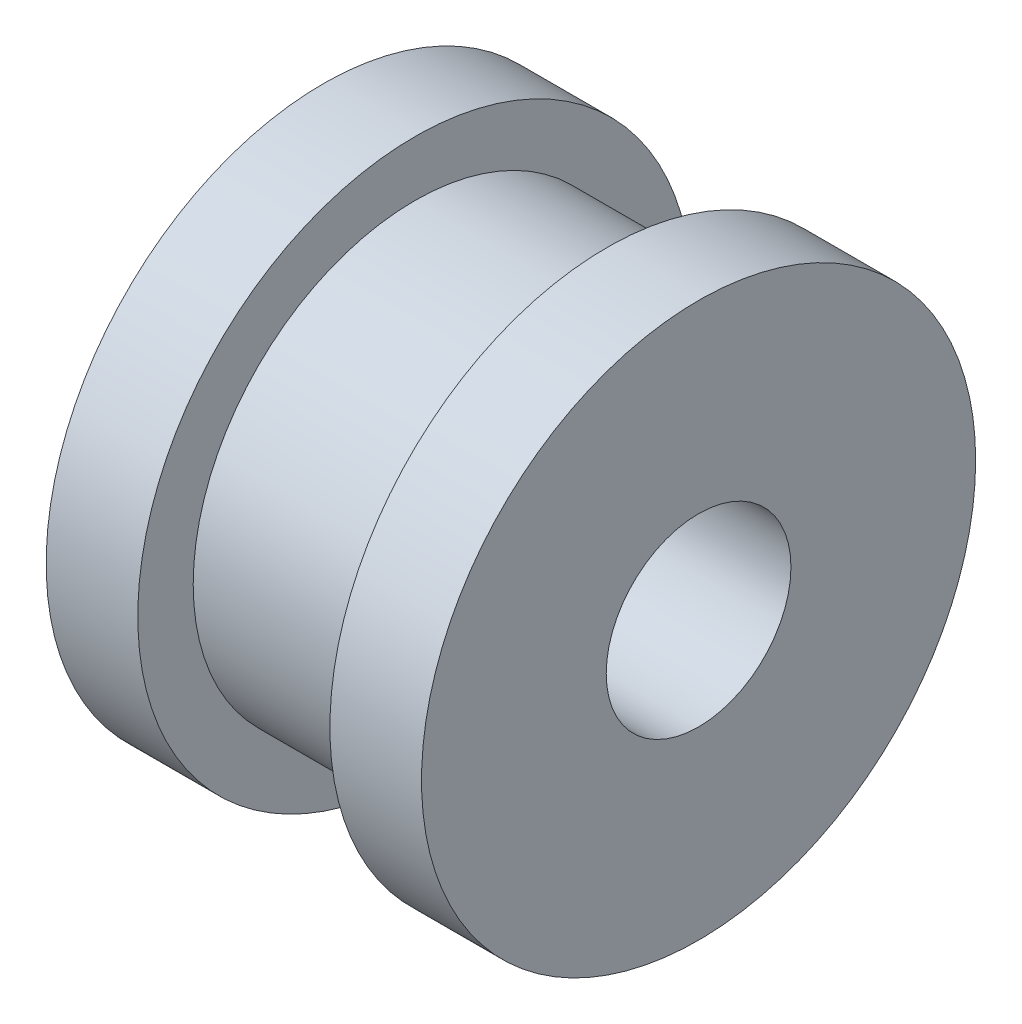
ISO-10303-21;
HEADER;
FILE_DESCRIPTION(('STEP AP214'),'2;1');
FILE_NAME('part.step','',(''),(''),'','','');
FILE_SCHEMA(('AUTOMOTIVE_DESIGN { 1 0 10303 214 1 1 1 1 }'));
ENDSEC;
DATA;
#1=APPLICATION_CONTEXT('core data for automotive mechanical design processes');
#2=APPLICATION_PROTOCOL_DEFINITION('international standard','automotive_design',2000,#1);
#3=PRODUCT_CONTEXT('',#1,'mechanical');
#4=PRODUCT('Part','Part','',(#3));
#5=PRODUCT_RELATED_PRODUCT_CATEGORY('part','',(#4));
#6=PRODUCT_DEFINITION_FORMATION('','',#4);
#7=PRODUCT_DEFINITION_CONTEXT('part definition',#1,'design');
#8=PRODUCT_DEFINITION('design','',#6,#7);
#9=PRODUCT_DEFINITION_SHAPE('','',#8);
#10=(LENGTH_UNIT() NAMED_UNIT(*) SI_UNIT(.MILLI.,.METRE.));
#11=(NAMED_UNIT(*) PLANE_ANGLE_UNIT() SI_UNIT($,.RADIAN.));
#12=(NAMED_UNIT(*) SI_UNIT($,.STERADIAN.) SOLID_ANGLE_UNIT());
#13=UNCERTAINTY_MEASURE_WITH_UNIT(LENGTH_MEASURE(1.E-05),#10,'distance_accuracy_value','');
#14=(GEOMETRIC_REPRESENTATION_CONTEXT(3) GLOBAL_UNCERTAINTY_ASSIGNED_CONTEXT((#13)) GLOBAL_UNIT_ASSIGNED_CONTEXT((#10,
#11,#12)) REPRESENTATION_CONTEXT('',''));
#15=CARTESIAN_POINT('',(0.,0.,0.));
#16=DIRECTION('',(0.,0.,1.));
#17=DIRECTION('',(1.,0.,0.));
#18=AXIS2_PLACEMENT_3D('',#15,#16,#17);
#19=CARTESIAN_POINT('',(3.1496,0.,0.));
#20=DIRECTION('',(1.,0.,0.));
#21=DIRECTION('',(0.,0.,-1.));
#22=AXIS2_PLACEMENT_3D('',#19,#20,#21);
#23=PLANE('',#22);
#24=CARTESIAN_POINT('',(3.1496,0.,0.));
#25=DIRECTION('',(1.,0.,0.));
#26=DIRECTION('',(0.,0.,-1.));
#27=AXIS2_PLACEMENT_3D('',#24,#25,#26);
#28=CIRCLE('',#27,9.525);
#29=CARTESIAN_POINT('',(3.1496,0.,-9.525));
#30=VERTEX_POINT('',#29);
#31=EDGE_CURVE('E10',#30,#30,#28,.T.);
#32=ORIENTED_EDGE('',*,*,#31,.T.);
#33=EDGE_LOOP('',(#32));
#34=FACE_BOUND('',#33,.T.);
#35=CARTESIAN_POINT('',(3.1496,0.,0.));
#36=DIRECTION('',(1.,0.,0.));
#37=DIRECTION('',(0.,0.,-1.));
#38=AXIS2_PLACEMENT_3D('',#35,#36,#37);
#39=CIRCLE('',#38,7.62);
#40=CARTESIAN_POINT('',(3.1496,0.,7.62));
#41=VERTEX_POINT('',#40);
#42=EDGE_CURVE('E47',#41,#41,#39,.T.);
#43=ORIENTED_EDGE('',*,*,#42,.F.);
#44=EDGE_LOOP('',(#43));
#45=FACE_BOUND('',#44,.T.);
#46=ADVANCED_FACE('F31',(#34,#45),#23,.T.);
#47=CARTESIAN_POINT('',(0.,0.,0.));
#48=DIRECTION('',(1.,0.,0.));
#49=DIRECTION('',(0.,0.,-1.));
#50=AXIS2_PLACEMENT_3D('',#47,#48,#49);
#51=PLANE('',#50);
#52=CARTESIAN_POINT('',(0.,0.,0.));
#53=DIRECTION('',(1.,0.,0.));
#54=DIRECTION('',(0.,0.,-1.));
#55=AXIS2_PLACEMENT_3D('',#52,#53,#54);
#56=CIRCLE('',#55,9.525);
#57=CARTESIAN_POINT('',(0.,0.,-9.525));
#58=VERTEX_POINT('',#57);
#59=EDGE_CURVE('E35',#58,#58,#56,.T.);
#60=ORIENTED_EDGE('',*,*,#59,.F.);
#61=EDGE_LOOP('',(#60));
#62=FACE_BOUND('',#61,.T.);
#63=CARTESIAN_POINT('',(0.,0.,0.));
#64=DIRECTION('',(1.,0.,0.));
#65=DIRECTION('',(0.,0.,-1.));
#66=AXIS2_PLACEMENT_3D('',#63,#64,#65);
#67=CIRCLE('',#66,3.175);
#68=CARTESIAN_POINT('',(0.,0.,-3.175));
#69=VERTEX_POINT('',#68);
#70=EDGE_CURVE('E42',#69,#69,#67,.T.);
#71=ORIENTED_EDGE('',*,*,#70,.T.);
#72=EDGE_LOOP('',(#71));
#73=FACE_BOUND('',#72,.T.);
#74=ADVANCED_FACE('F80',(#62,#73),#51,.F.);
#75=CARTESIAN_POINT('',(3.1496,0.,0.));
#76=DIRECTION('',(-1.,0.,0.));
#77=DIRECTION('',(0.,0.,1.));
#78=AXIS2_PLACEMENT_3D('',#75,#76,#77);
#79=CYLINDRICAL_SURFACE('',#78,9.525);
#80=ORIENTED_EDGE('',*,*,#31,.F.);
#81=EDGE_LOOP('',(#80));
#82=FACE_BOUND('',#81,.T.);
#83=ORIENTED_EDGE('',*,*,#59,.T.);
#84=EDGE_LOOP('',(#83));
#85=FACE_BOUND('',#84,.T.);
#86=ADVANCED_FACE('F33',(#82,#85),#79,.T.);
#87=CARTESIAN_POINT('',(3.1496,0.,0.));
#88=DIRECTION('',(-1.,0.,0.));
#89=DIRECTION('',(0.,0.,1.));
#90=AXIS2_PLACEMENT_3D('',#87,#88,#89);
#91=CYLINDRICAL_SURFACE('',#90,3.175);
#92=ORIENTED_EDGE('',*,*,#70,.F.);
#93=EDGE_LOOP('',(#92));
#94=FACE_BOUND('',#93,.T.);
#95=CARTESIAN_POINT('',(12.9032,0.,0.));
#96=DIRECTION('',(1.,0.,0.));
#97=DIRECTION('',(0.,0.,-1.));
#98=AXIS2_PLACEMENT_3D('',#95,#96,#97);
#99=CIRCLE('',#98,3.175);
#100=CARTESIAN_POINT('',(12.9032,0.,-3.175));
#101=VERTEX_POINT('',#100);
#102=EDGE_CURVE('E56',#101,#101,#99,.T.);
#103=ORIENTED_EDGE('',*,*,#102,.T.);
#104=EDGE_LOOP('',(#103));
#105=FACE_BOUND('',#104,.T.);
#106=ADVANCED_FACE('F62',(#94,#105),#91,.F.);
#107=CARTESIAN_POINT('',(9.7536,0.,0.));
#108=DIRECTION('',(-1.,0.,0.));
#109=DIRECTION('',(0.,0.,1.));
#110=AXIS2_PLACEMENT_3D('',#107,#108,#109);
#111=CYLINDRICAL_SURFACE('',#110,7.62);
#112=CARTESIAN_POINT('',(9.7536,0.,0.));
#113=DIRECTION('',(1.,0.,0.));
#114=DIRECTION('',(0.,0.,-1.));
#115=AXIS2_PLACEMENT_3D('',#112,#113,#114);
#116=CIRCLE('',#115,7.62);
#117=CARTESIAN_POINT('',(9.7536,0.,7.62));
#118=VERTEX_POINT('',#117);
#119=EDGE_CURVE('E46',#118,#118,#116,.T.);
#120=CARTESIAN_POINT('',(9.7536,0.,7.62));
#121=CARTESIAN_POINT('',(9.68480833333333,0.,7.62));
#122=CARTESIAN_POINT('',(9.61601666666667,0.,7.62));
#123=CARTESIAN_POINT('',(9.47843333333333,0.,7.62));
#124=CARTESIAN_POINT('',(9.40964166666666,0.,7.62));
#125=CARTESIAN_POINT('',(9.27205833333333,0.,7.62));
#126=CARTESIAN_POINT('',(9.20326666666667,0.,7.62));
#127=CARTESIAN_POINT('',(9.06568333333333,0.,7.62));
#128=CARTESIAN_POINT('',(8.99689166666666,0.,7.62));
#129=CARTESIAN_POINT('',(8.85930833333333,0.,7.62));
#130=CARTESIAN_POINT('',(8.79051666666667,0.,7.62));
#131=CARTESIAN_POINT('',(8.65293333333333,0.,7.62));
#132=CARTESIAN_POINT('',(8.58414166666666,0.,7.62));
#133=CARTESIAN_POINT('',(8.44655833333333,0.,7.62));
#134=CARTESIAN_POINT('',(8.37776666666667,0.,7.62));
#135=CARTESIAN_POINT('',(8.24018333333333,0.,7.62));
#136=CARTESIAN_POINT('',(8.17139166666666,0.,7.62));
#137=CARTESIAN_POINT('',(8.03380833333333,0.,7.62));
#138=CARTESIAN_POINT('',(7.96501666666667,0.,7.62));
#139=CARTESIAN_POINT('',(7.82743333333333,0.,7.62));
#140=CARTESIAN_POINT('',(7.75864166666667,0.,7.62));
#141=CARTESIAN_POINT('',(7.62105833333333,0.,7.62));
#142=CARTESIAN_POINT('',(7.55226666666667,0.,7.62));
#143=CARTESIAN_POINT('',(7.41468333333333,0.,7.62));
#144=CARTESIAN_POINT('',(7.34589166666667,0.,7.62));
#145=CARTESIAN_POINT('',(7.20830833333333,0.,7.62));
#146=CARTESIAN_POINT('',(7.13951666666667,0.,7.62));
#147=CARTESIAN_POINT('',(7.00193333333333,0.,7.62));
#148=CARTESIAN_POINT('',(6.93314166666667,0.,7.62));
#149=CARTESIAN_POINT('',(6.79555833333333,0.,7.62));
#150=CARTESIAN_POINT('',(6.72676666666667,0.,7.62));
#151=CARTESIAN_POINT('',(6.58918333333333,0.,7.62));
#152=CARTESIAN_POINT('',(6.52039166666667,0.,7.62));
#153=CARTESIAN_POINT('',(6.38280833333333,0.,7.62));
#154=CARTESIAN_POINT('',(6.31401666666667,0.,7.62));
#155=CARTESIAN_POINT('',(6.17643333333333,0.,7.62));
#156=CARTESIAN_POINT('',(6.10764166666667,0.,7.62));
#157=CARTESIAN_POINT('',(5.97005833333333,0.,7.62));
#158=CARTESIAN_POINT('',(5.90126666666667,0.,7.62));
#159=CARTESIAN_POINT('',(5.76368333333333,0.,7.62));
#160=CARTESIAN_POINT('',(5.69489166666667,0.,7.62));
#161=CARTESIAN_POINT('',(5.55730833333333,0.,7.62));
#162=CARTESIAN_POINT('',(5.48851666666667,0.,7.62));
#163=CARTESIAN_POINT('',(5.35093333333333,0.,7.62));
#164=CARTESIAN_POINT('',(5.28214166666667,0.,7.62));
#165=CARTESIAN_POINT('',(5.14455833333333,0.,7.62));
#166=CARTESIAN_POINT('',(5.07576666666667,0.,7.62));
#167=CARTESIAN_POINT('',(4.93818333333333,0.,7.62));
#168=CARTESIAN_POINT('',(4.86939166666667,0.,7.62));
#169=CARTESIAN_POINT('',(4.73180833333333,0.,7.62));
#170=CARTESIAN_POINT('',(4.66301666666667,0.,7.62));
#171=CARTESIAN_POINT('',(4.52543333333333,0.,7.62));
#172=CARTESIAN_POINT('',(4.45664166666667,0.,7.62));
#173=CARTESIAN_POINT('',(4.31905833333333,0.,7.62));
#174=CARTESIAN_POINT('',(4.25026666666667,0.,7.62));
#175=CARTESIAN_POINT('',(4.11268333333333,0.,7.62));
#176=CARTESIAN_POINT('',(4.04389166666667,0.,7.62));
#177=CARTESIAN_POINT('',(3.90630833333333,0.,7.62));
#178=CARTESIAN_POINT('',(3.83751666666667,0.,7.62));
#179=CARTESIAN_POINT('',(3.69993333333333,0.,7.62));
#180=CARTESIAN_POINT('',(3.63114166666667,0.,7.62));
#181=CARTESIAN_POINT('',(3.49355833333333,0.,7.62));
#182=CARTESIAN_POINT('',(3.42476666666667,0.,7.62));
#183=CARTESIAN_POINT('',(3.28718333333333,0.,7.62));
#184=CARTESIAN_POINT('',(3.21839166666667,0.,7.62));
#185=CARTESIAN_POINT('',(3.1496,0.,7.62));
#186=B_SPLINE_CURVE_WITH_KNOTS('',3,(#120,#121,#122,#123,#124,#125,#126,#127,#128,#129,#130,
#131,#132,#133,#134,#135,#136,#137,#138,#139,#140,#141,#142,#143,#144,#145,#146,#147,#148,#149,
#150,#151,#152,#153,#154,#155,#156,#157,#158,#159,#160,#161,#162,#163,#164,#165,#166,#167,#168,
#169,#170,#171,#172,#173,#174,#175,#176,#177,#178,#179,#180,#181,#182,#183,#184,#185),
.UNSPECIFIED.,.F.,.F.,(4,2,2,2,2,2,2,2,2,2,2,2,2,2,2,2,2,2,2,2,2,2,2,2,2,2,2,2,2,2,2,2,4),(0.,
0.206374999999998,0.41275,0.619124999999998,0.8255,1.031875,1.23825,1.444625,1.651,1.857375,
2.06375,2.270125,2.4765,2.682875,2.88925,3.095625,3.302,3.508375,3.71475,3.921125,4.1275,
4.333875,4.54025,4.746625,4.953,5.159375,5.36575,5.572125,5.7785,5.984875,6.19125,6.397625,
6.604),.UNSPECIFIED.);
#187=EDGE_CURVE('BSEAM76',#118,#41,#186,.T.);
#188=ORIENTED_EDGE('',*,*,#119,.F.);
#189=ORIENTED_EDGE('',*,*,#42,.T.);
#190=ORIENTED_EDGE('',*,*,#187,.T.);
#191=ORIENTED_EDGE('',*,*,#187,.F.);
#192=EDGE_LOOP('',(#188,#190,#189,#191));
#193=FACE_BOUND('',#192,.T.);
#194=ADVANCED_FACE('F76',(#193),#111,.T.);
#195=CARTESIAN_POINT('',(9.7536,0.,0.));
#196=DIRECTION('',(1.,0.,0.));
#197=DIRECTION('',(0.,0.,-1.));
#198=AXIS2_PLACEMENT_3D('',#195,#196,#197);
#199=PLANE('',#198);
#200=CARTESIAN_POINT('',(9.7536,0.,0.));
#201=DIRECTION('',(1.,0.,0.));
#202=DIRECTION('',(0.,0.,-1.));
#203=AXIS2_PLACEMENT_3D('',#200,#201,#202);
#204=CIRCLE('',#203,9.525);
#205=CARTESIAN_POINT('',(9.7536,0.,-9.525));
#206=VERTEX_POINT('',#205);
#207=EDGE_CURVE('E53',#206,#206,#204,.T.);
#208=ORIENTED_EDGE('',*,*,#207,.F.);
#209=EDGE_LOOP('',(#208));
#210=FACE_BOUND('',#209,.T.);
#211=ORIENTED_EDGE('',*,*,#119,.T.);
#212=EDGE_LOOP('',(#211));
#213=FACE_BOUND('',#212,.T.);
#214=ADVANCED_FACE('F67',(#210,#213),#199,.F.);
#215=CARTESIAN_POINT('',(12.9032,0.,0.));
#216=DIRECTION('',(1.,0.,0.));
#217=DIRECTION('',(0.,0.,-1.));
#218=AXIS2_PLACEMENT_3D('',#215,#216,#217);
#219=PLANE('',#218);
#220=CARTESIAN_POINT('',(12.9032,0.,0.));
#221=DIRECTION('',(1.,0.,0.));
#222=DIRECTION('',(0.,0.,-1.));
#223=AXIS2_PLACEMENT_3D('',#220,#221,#222);
#224=CIRCLE('',#223,9.525);
#225=CARTESIAN_POINT('',(12.9032,0.,-9.525));
#226=VERTEX_POINT('',#225);
#227=EDGE_CURVE('E50',#226,#226,#224,.T.);
#228=ORIENTED_EDGE('',*,*,#227,.T.);
#229=EDGE_LOOP('',(#228));
#230=FACE_BOUND('',#229,.T.);
#231=ORIENTED_EDGE('',*,*,#102,.F.);
#232=EDGE_LOOP('',(#231));
#233=FACE_BOUND('',#232,.T.);
#234=ADVANCED_FACE('F64',(#230,#233),#219,.T.);
#235=CARTESIAN_POINT('',(12.9032,0.,0.));
#236=DIRECTION('',(-1.,0.,0.));
#237=DIRECTION('',(0.,0.,1.));
#238=AXIS2_PLACEMENT_3D('',#235,#236,#237);
#239=CYLINDRICAL_SURFACE('',#238,9.525);
#240=ORIENTED_EDGE('',*,*,#227,.F.);
#241=EDGE_LOOP('',(#240));
#242=FACE_BOUND('',#241,.T.);
#243=ORIENTED_EDGE('',*,*,#207,.T.);
#244=EDGE_LOOP('',(#243));
#245=FACE_BOUND('',#244,.T.);
#246=ADVANCED_FACE('F66',(#242,#245),#239,.T.);
#247=CLOSED_SHELL('',(#46,#74,#86,#106,#194,#214,#234,#246));
#248=MANIFOLD_SOLID_BREP('B2',#247);
#249=ADVANCED_BREP_SHAPE_REPRESENTATION('',(#18,#248),#14);
#250=SHAPE_DEFINITION_REPRESENTATION(#9,#249);
ENDSEC;
END-ISO-10303-21;
